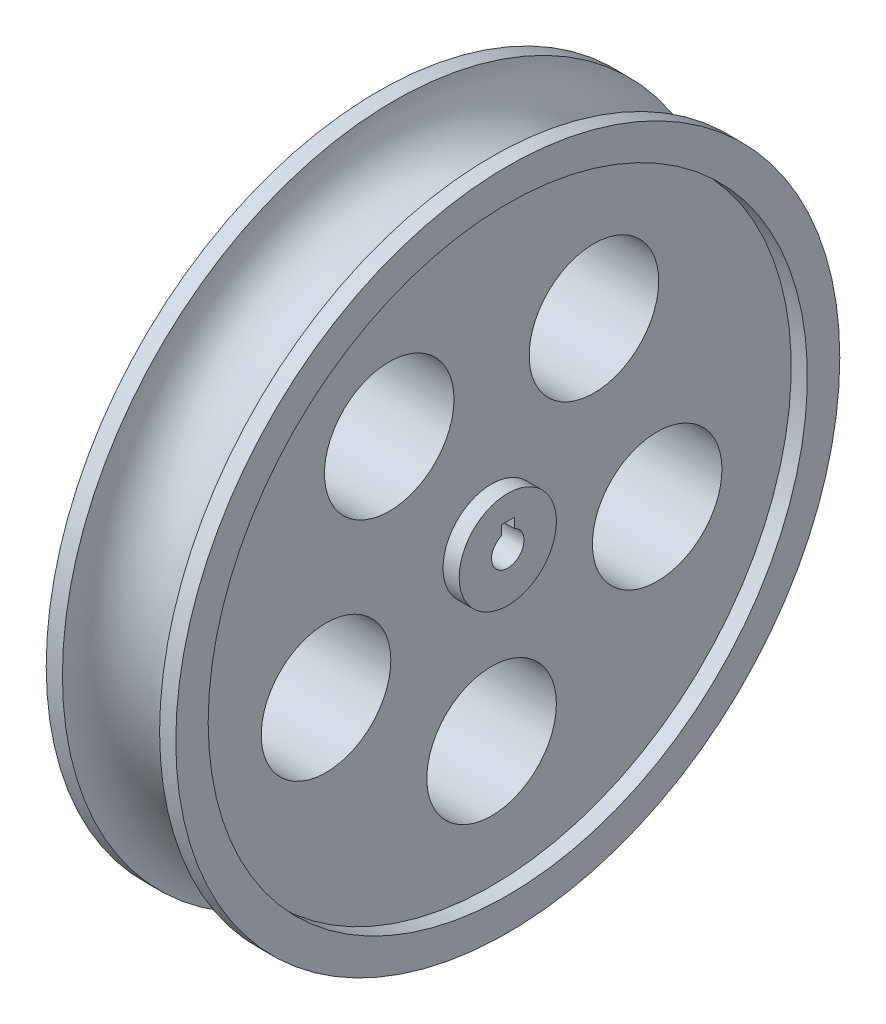
ISO-10303-21;
HEADER;
FILE_DESCRIPTION(('STEP AP214'),'2;1');
FILE_NAME('part.step','',(''),(''),'','','');
FILE_SCHEMA(('AUTOMOTIVE_DESIGN { 1 0 10303 214 1 1 1 1 }'));
ENDSEC;
DATA;
#1=APPLICATION_CONTEXT('core data for automotive mechanical design processes');
#2=APPLICATION_PROTOCOL_DEFINITION('international standard','automotive_design',2000,#1);
#3=PRODUCT_CONTEXT('',#1,'mechanical');
#4=PRODUCT('Part','Part','',(#3));
#5=PRODUCT_RELATED_PRODUCT_CATEGORY('part','',(#4));
#6=PRODUCT_DEFINITION_FORMATION('','',#4);
#7=PRODUCT_DEFINITION_CONTEXT('part definition',#1,'design');
#8=PRODUCT_DEFINITION('design','',#6,#7);
#9=PRODUCT_DEFINITION_SHAPE('','',#8);
#10=(LENGTH_UNIT() NAMED_UNIT(*) SI_UNIT(.MILLI.,.METRE.));
#11=(NAMED_UNIT(*) PLANE_ANGLE_UNIT() SI_UNIT($,.RADIAN.));
#12=(NAMED_UNIT(*) SI_UNIT($,.STERADIAN.) SOLID_ANGLE_UNIT());
#13=UNCERTAINTY_MEASURE_WITH_UNIT(LENGTH_MEASURE(1.E-05),#10,'distance_accuracy_value','');
#14=(GEOMETRIC_REPRESENTATION_CONTEXT(3) GLOBAL_UNCERTAINTY_ASSIGNED_CONTEXT((#13)) GLOBAL_UNIT_ASSIGNED_CONTEXT((#10,
#11,#12)) REPRESENTATION_CONTEXT('',''));
#15=CARTESIAN_POINT('',(0.,0.,0.));
#16=DIRECTION('',(0.,0.,1.));
#17=DIRECTION('',(1.,0.,0.));
#18=AXIS2_PLACEMENT_3D('',#15,#16,#17);
#19=CARTESIAN_POINT('',(75.,75.,0.));
#20=DIRECTION('',(-1.,0.,0.));
#21=DIRECTION('',(0.,0.,1.));
#22=AXIS2_PLACEMENT_3D('',#19,#20,#21);
#23=PLANE('',#22);
#24=CARTESIAN_POINT('',(75.,217.423317238266,-157.967286553604));
#25=DIRECTION('',(1.,0.,0.));
#26=DIRECTION('',(0.,0.,-1.));
#27=AXIS2_PLACEMENT_3D('',#24,#25,#26);
#28=CIRCLE('',#27,100.);
#29=CARTESIAN_POINT('',(75.,217.423317238266,-257.967286553604));
#30=VERTEX_POINT('',#29);
#31=EDGE_CURVE('E377',#30,#30,#28,.T.);
#32=ORIENTED_EDGE('',*,*,#31,.F.);
#33=EDGE_LOOP('',(#32));
#34=FACE_BOUND('',#33,.T.);
#35=CARTESIAN_POINT('',(75.,217.423317238268,157.967286553601));
#36=DIRECTION('',(1.,0.,0.));
#37=DIRECTION('',(0.,0.,-1.));
#38=AXIS2_PLACEMENT_3D('',#35,#36,#37);
#39=CIRCLE('',#38,100.);
#40=CARTESIAN_POINT('',(75.,217.423317238268,57.9672865536009));
#41=VERTEX_POINT('',#40);
#42=EDGE_CURVE('E381',#41,#41,#39,.T.);
#43=ORIENTED_EDGE('',*,*,#42,.F.);
#44=EDGE_LOOP('',(#43));
#45=FACE_BOUND('',#44,.T.);
#46=CARTESIAN_POINT('',(75.,-83.0483172382664,255.596438754323));
#47=DIRECTION('',(1.,0.,0.));
#48=DIRECTION('',(0.,0.,-1.));
#49=AXIS2_PLACEMENT_3D('',#46,#47,#48);
#50=CIRCLE('',#49,100.);
#51=CARTESIAN_POINT('',(75.,-83.0483172382664,155.596438754323));
#52=VERTEX_POINT('',#51);
#53=EDGE_CURVE('E374',#52,#52,#50,.T.);
#54=ORIENTED_EDGE('',*,*,#53,.F.);
#55=EDGE_LOOP('',(#54));
#56=FACE_BOUND('',#55,.T.);
#57=CARTESIAN_POINT('',(75.,-268.75,0.));
#58=DIRECTION('',(1.,0.,0.));
#59=DIRECTION('',(0.,0.,-1.));
#60=AXIS2_PLACEMENT_3D('',#57,#58,#59);
#61=CIRCLE('',#60,100.);
#62=CARTESIAN_POINT('',(75.,-268.75,-100.));
#63=VERTEX_POINT('',#62);
#64=EDGE_CURVE('E370',#63,#63,#61,.T.);
#65=ORIENTED_EDGE('',*,*,#64,.F.);
#66=EDGE_LOOP('',(#65));
#67=FACE_BOUND('',#66,.T.);
#68=CARTESIAN_POINT('',(75.,0.,0.));
#69=DIRECTION('',(-1.,0.,0.));
#70=DIRECTION('',(0.,0.,1.));
#71=AXIS2_PLACEMENT_3D('',#68,#69,#70);
#72=CIRCLE('',#71,462.5);
#73=CARTESIAN_POINT('',(75.,0.,462.5));
#74=VERTEX_POINT('',#73);
#75=EDGE_CURVE('E139',#74,#74,#72,.T.);
#76=ORIENTED_EDGE('',*,*,#75,.F.);
#77=EDGE_LOOP('',(#76));
#78=FACE_BOUND('',#77,.T.);
#79=CARTESIAN_POINT('',(75.,0.,0.));
#80=DIRECTION('',(-1.,0.,0.));
#81=DIRECTION('',(0.,0.,1.));
#82=AXIS2_PLACEMENT_3D('',#79,#80,#81);
#83=CIRCLE('',#82,75.);
#84=CARTESIAN_POINT('',(75.,0.,75.));
#85=VERTEX_POINT('',#84);
#86=EDGE_CURVE('E129',#85,#85,#83,.T.);
#87=ORIENTED_EDGE('',*,*,#86,.T.);
#88=EDGE_LOOP('',(#87));
#89=FACE_BOUND('',#88,.T.);
#90=CARTESIAN_POINT('',(75.,-83.04831723827,-255.596438754322));
#91=DIRECTION('',(1.,0.,0.));
#92=DIRECTION('',(0.,0.,-1.));
#93=AXIS2_PLACEMENT_3D('',#90,#91,#92);
#94=CIRCLE('',#93,100.);
#95=CARTESIAN_POINT('',(75.,-83.04831723827,-355.596438754322));
#96=VERTEX_POINT('',#95);
#97=EDGE_CURVE('E348',#96,#96,#94,.T.);
#98=ORIENTED_EDGE('',*,*,#97,.F.);
#99=EDGE_LOOP('',(#98));
#100=FACE_BOUND('',#99,.T.);
#101=ADVANCED_FACE('F47',(#34,#45,#56,#67,#78,#89,#100),#23,.F.);
#102=CARTESIAN_POINT('',(-60.7607906597794,0.,0.));
#103=DIRECTION('',(-1.,0.,0.));
#104=DIRECTION('',(0.,0.,1.));
#105=AXIS2_PLACEMENT_3D('',#102,#103,#104);
#106=CYLINDRICAL_SURFACE('',#105,75.);
#107=ORIENTED_EDGE('',*,*,#86,.F.);
#108=EDGE_LOOP('',(#107));
#109=FACE_BOUND('',#108,.T.);
#110=CARTESIAN_POINT('',(100.,0.,0.));
#111=DIRECTION('',(-1.,0.,0.));
#112=DIRECTION('',(0.,0.,1.));
#113=AXIS2_PLACEMENT_3D('',#110,#111,#112);
#114=CIRCLE('',#113,75.);
#115=CARTESIAN_POINT('',(100.,0.,75.));
#116=VERTEX_POINT('',#115);
#117=EDGE_CURVE('E11',#116,#116,#114,.T.);
#118=ORIENTED_EDGE('',*,*,#117,.T.);
#119=EDGE_LOOP('',(#118));
#120=FACE_BOUND('',#119,.T.);
#121=ADVANCED_FACE('F49',(#109,#120),#106,.T.);
#122=CARTESIAN_POINT('',(100.,25.,0.));
#123=DIRECTION('',(-1.,0.,0.));
#124=DIRECTION('',(0.,0.,1.));
#125=AXIS2_PLACEMENT_3D('',#122,#123,#124);
#126=PLANE('',#125);
#127=ORIENTED_EDGE('',*,*,#117,.F.);
#128=EDGE_LOOP('',(#127));
#129=FACE_BOUND('',#128,.T.);
#130=DIRECTION('',(0.,0.,1.));
#131=VECTOR('',#130,1.);
#132=CARTESIAN_POINT('',(100.,37.9128784747792,10.));
#133=LINE('',#132,#131);
#134=CARTESIAN_POINT('',(100.,37.9128784747792,-10.));
#135=VERTEX_POINT('',#134);
#136=CARTESIAN_POINT('',(100.,37.9128784747792,10.));
#137=VERTEX_POINT('',#136);
#138=EDGE_CURVE('E115',#135,#137,#133,.T.);
#139=ORIENTED_EDGE('',*,*,#138,.F.);
#140=DIRECTION('',(0.,1.,0.));
#141=VECTOR('',#140,1.);
#142=CARTESIAN_POINT('',(100.,22.9128784747792,-10.));
#143=LINE('',#142,#141);
#144=CARTESIAN_POINT('',(100.,22.9128784747792,-10.));
#145=VERTEX_POINT('',#144);
#146=EDGE_CURVE('E93',#145,#135,#143,.T.);
#147=ORIENTED_EDGE('',*,*,#146,.F.);
#148=CARTESIAN_POINT('',(100.,0.,0.));
#149=DIRECTION('',(-1.,0.,0.));
#150=DIRECTION('',(0.,0.,1.));
#151=AXIS2_PLACEMENT_3D('',#148,#149,#150);
#152=CIRCLE('',#151,25.);
#153=CARTESIAN_POINT('',(100.,22.9128784747792,10.));
#154=VERTEX_POINT('',#153);
#155=EDGE_CURVE('E57',#145,#154,#152,.T.);
#156=ORIENTED_EDGE('',*,*,#155,.T.);
#157=DIRECTION('',(0.,-1.,0.));
#158=VECTOR('',#157,1.);
#159=CARTESIAN_POINT('',(100.,37.9128784747792,10.));
#160=LINE('',#159,#158);
#161=EDGE_CURVE('E112',#137,#154,#160,.T.);
#162=ORIENTED_EDGE('',*,*,#161,.F.);
#163=EDGE_LOOP('',(#139,#147,#156,#162));
#164=FACE_BOUND('',#163,.T.);
#165=ADVANCED_FACE('F186',(#129,#164),#126,.F.);
#166=CARTESIAN_POINT('',(-60.7607906597794,0.,0.));
#167=DIRECTION('',(-1.,0.,0.));
#168=DIRECTION('',(0.,0.,1.));
#169=AXIS2_PLACEMENT_3D('',#166,#167,#168);
#170=CYLINDRICAL_SURFACE('',#169,25.);
#171=ORIENTED_EDGE('',*,*,#155,.F.);
#172=DIRECTION('',(1.,0.,0.));
#173=VECTOR('',#172,1.);
#174=CARTESIAN_POINT('',(-100.,22.9128784747792,-10.));
#175=LINE('',#174,#173);
#176=CARTESIAN_POINT('',(-100.,22.9128784747792,-10.));
#177=VERTEX_POINT('',#176);
#178=EDGE_CURVE('E88',#177,#145,#175,.T.);
#179=ORIENTED_EDGE('',*,*,#178,.F.);
#180=CARTESIAN_POINT('',(-100.,0.,0.));
#181=DIRECTION('',(-1.,0.,0.));
#182=DIRECTION('',(0.,0.,1.));
#183=AXIS2_PLACEMENT_3D('',#180,#181,#182);
#184=CIRCLE('',#183,25.);
#185=CARTESIAN_POINT('',(-100.,22.9128784747792,10.));
#186=VERTEX_POINT('',#185);
#187=EDGE_CURVE('E110',#177,#186,#184,.T.);
#188=ORIENTED_EDGE('',*,*,#187,.T.);
#189=DIRECTION('',(1.,0.,0.));
#190=VECTOR('',#189,1.);
#191=CARTESIAN_POINT('',(-100.,22.9128784747792,10.));
#192=LINE('',#191,#190);
#193=EDGE_CURVE('E130',#186,#154,#192,.T.);
#194=ORIENTED_EDGE('',*,*,#193,.T.);
#195=EDGE_LOOP('',(#171,#179,#188,#194));
#196=FACE_BOUND('',#195,.T.);
#197=ADVANCED_FACE('F188',(#196),#170,.F.);
#198=CARTESIAN_POINT('',(-100.,75.,0.));
#199=DIRECTION('',(1.,0.,0.));
#200=DIRECTION('',(0.,0.,-1.));
#201=AXIS2_PLACEMENT_3D('',#198,#199,#200);
#202=PLANE('',#201);
#203=ORIENTED_EDGE('',*,*,#187,.F.);
#204=DIRECTION('',(0.,1.,0.));
#205=VECTOR('',#204,1.);
#206=CARTESIAN_POINT('',(-100.,22.9128784747792,-10.));
#207=LINE('',#206,#205);
#208=CARTESIAN_POINT('',(-100.,37.9128784747792,-10.));
#209=VERTEX_POINT('',#208);
#210=EDGE_CURVE('E73',#177,#209,#207,.T.);
#211=ORIENTED_EDGE('',*,*,#210,.T.);
#212=DIRECTION('',(0.,0.,1.));
#213=VECTOR('',#212,1.);
#214=CARTESIAN_POINT('',(-100.,37.9128784747792,10.));
#215=LINE('',#214,#213);
#216=CARTESIAN_POINT('',(-100.,37.9128784747792,10.));
#217=VERTEX_POINT('',#216);
#218=EDGE_CURVE('E101',#209,#217,#215,.T.);
#219=ORIENTED_EDGE('',*,*,#218,.T.);
#220=DIRECTION('',(0.,-1.,0.));
#221=VECTOR('',#220,1.);
#222=CARTESIAN_POINT('',(-100.,37.9128784747792,10.));
#223=LINE('',#222,#221);
#224=EDGE_CURVE('E64',#217,#186,#223,.T.);
#225=ORIENTED_EDGE('',*,*,#224,.T.);
#226=EDGE_LOOP('',(#203,#211,#219,#225));
#227=FACE_BOUND('',#226,.T.);
#228=CARTESIAN_POINT('',(-100.,0.,0.));
#229=DIRECTION('',(-1.,0.,0.));
#230=DIRECTION('',(0.,0.,1.));
#231=AXIS2_PLACEMENT_3D('',#228,#229,#230);
#232=CIRCLE('',#231,75.);
#233=CARTESIAN_POINT('',(-100.,0.,75.));
#234=VERTEX_POINT('',#233);
#235=EDGE_CURVE('E175',#234,#234,#232,.T.);
#236=ORIENTED_EDGE('',*,*,#235,.T.);
#237=EDGE_LOOP('',(#236));
#238=FACE_BOUND('',#237,.T.);
#239=ADVANCED_FACE('F107',(#227,#238),#202,.F.);
#240=CARTESIAN_POINT('',(-60.7607906597794,0.,0.));
#241=DIRECTION('',(-1.,0.,0.));
#242=DIRECTION('',(0.,0.,1.));
#243=AXIS2_PLACEMENT_3D('',#240,#241,#242);
#244=CYLINDRICAL_SURFACE('',#243,75.);
#245=ORIENTED_EDGE('',*,*,#235,.F.);
#246=EDGE_LOOP('',(#245));
#247=FACE_BOUND('',#246,.T.);
#248=CARTESIAN_POINT('',(-75.,0.,0.));
#249=DIRECTION('',(-1.,0.,0.));
#250=DIRECTION('',(0.,0.,1.));
#251=AXIS2_PLACEMENT_3D('',#248,#249,#250);
#252=CIRCLE('',#251,75.);
#253=CARTESIAN_POINT('',(-75.,0.,75.));
#254=VERTEX_POINT('',#253);
#255=EDGE_CURVE('E171',#254,#254,#252,.T.);
#256=ORIENTED_EDGE('',*,*,#255,.T.);
#257=EDGE_LOOP('',(#256));
#258=FACE_BOUND('',#257,.T.);
#259=ADVANCED_FACE('F241',(#247,#258),#244,.T.);
#260=CARTESIAN_POINT('',(-75.,462.5,0.));
#261=DIRECTION('',(1.,0.,0.));
#262=DIRECTION('',(0.,0.,-1.));
#263=AXIS2_PLACEMENT_3D('',#260,#261,#262);
#264=PLANE('',#263);
#265=CARTESIAN_POINT('',(-75.,-83.04831723827,-255.596438754322));
#266=DIRECTION('',(1.,0.,0.));
#267=DIRECTION('',(0.,0.,-1.));
#268=AXIS2_PLACEMENT_3D('',#265,#266,#267);
#269=CIRCLE('',#268,100.);
#270=CARTESIAN_POINT('',(-75.,-83.04831723827,-355.596438754322));
#271=VERTEX_POINT('',#270);
#272=EDGE_CURVE('E51',#271,#271,#269,.T.);
#273=ORIENTED_EDGE('',*,*,#272,.T.);
#274=EDGE_LOOP('',(#273));
#275=FACE_BOUND('',#274,.T.);
#276=CARTESIAN_POINT('',(-75.,217.423317238266,-157.967286553604));
#277=DIRECTION('',(1.,0.,0.));
#278=DIRECTION('',(0.,0.,-1.));
#279=AXIS2_PLACEMENT_3D('',#276,#277,#278);
#280=CIRCLE('',#279,100.);
#281=CARTESIAN_POINT('',(-75.,217.423317238266,-257.967286553604));
#282=VERTEX_POINT('',#281);
#283=EDGE_CURVE('E118',#282,#282,#280,.T.);
#284=ORIENTED_EDGE('',*,*,#283,.T.);
#285=EDGE_LOOP('',(#284));
#286=FACE_BOUND('',#285,.T.);
#287=CARTESIAN_POINT('',(-75.,217.423317238268,157.967286553601));
#288=DIRECTION('',(1.,0.,0.));
#289=DIRECTION('',(0.,0.,-1.));
#290=AXIS2_PLACEMENT_3D('',#287,#288,#289);
#291=CIRCLE('',#290,100.);
#292=CARTESIAN_POINT('',(-75.,217.423317238268,57.9672865536009));
#293=VERTEX_POINT('',#292);
#294=EDGE_CURVE('E354',#293,#293,#291,.T.);
#295=ORIENTED_EDGE('',*,*,#294,.T.);
#296=EDGE_LOOP('',(#295));
#297=FACE_BOUND('',#296,.T.);
#298=CARTESIAN_POINT('',(-75.,-83.0483172382664,255.596438754323));
#299=DIRECTION('',(1.,0.,0.));
#300=DIRECTION('',(0.,0.,-1.));
#301=AXIS2_PLACEMENT_3D('',#298,#299,#300);
#302=CIRCLE('',#301,100.);
#303=CARTESIAN_POINT('',(-75.,-83.0483172382664,155.596438754323));
#304=VERTEX_POINT('',#303);
#305=EDGE_CURVE('E359',#304,#304,#302,.T.);
#306=ORIENTED_EDGE('',*,*,#305,.T.);
#307=EDGE_LOOP('',(#306));
#308=FACE_BOUND('',#307,.T.);
#309=CARTESIAN_POINT('',(-75.,-268.75,0.));
#310=DIRECTION('',(1.,0.,0.));
#311=DIRECTION('',(0.,0.,-1.));
#312=AXIS2_PLACEMENT_3D('',#309,#310,#311);
#313=CIRCLE('',#312,100.);
#314=CARTESIAN_POINT('',(-75.,-268.75,-100.));
#315=VERTEX_POINT('',#314);
#316=EDGE_CURVE('E364',#315,#315,#313,.T.);
#317=ORIENTED_EDGE('',*,*,#316,.T.);
#318=EDGE_LOOP('',(#317));
#319=FACE_BOUND('',#318,.T.);
#320=ORIENTED_EDGE('',*,*,#255,.F.);
#321=EDGE_LOOP('',(#320));
#322=FACE_BOUND('',#321,.T.);
#323=CARTESIAN_POINT('',(-75.,0.,0.));
#324=DIRECTION('',(-1.,0.,0.));
#325=DIRECTION('',(0.,0.,1.));
#326=AXIS2_PLACEMENT_3D('',#323,#324,#325);
#327=CIRCLE('',#326,462.5);
#328=CARTESIAN_POINT('',(-75.,0.,462.5));
#329=VERTEX_POINT('',#328);
#330=EDGE_CURVE('E167',#329,#329,#327,.T.);
#331=ORIENTED_EDGE('',*,*,#330,.T.);
#332=EDGE_LOOP('',(#331));
#333=FACE_BOUND('',#332,.T.);
#334=ADVANCED_FACE('F238',(#275,#286,#297,#308,#319,#322,#333),#264,.F.);
#335=CARTESIAN_POINT('',(-60.7607906597794,0.,0.));
#336=DIRECTION('',(-1.,0.,0.));
#337=DIRECTION('',(0.,0.,1.));
#338=AXIS2_PLACEMENT_3D('',#335,#336,#337);
#339=CYLINDRICAL_SURFACE('',#338,462.5);
#340=ORIENTED_EDGE('',*,*,#330,.F.);
#341=EDGE_LOOP('',(#340));
#342=FACE_BOUND('',#341,.T.);
#343=CARTESIAN_POINT('',(-100.,0.,0.));
#344=DIRECTION('',(-1.,0.,0.));
#345=DIRECTION('',(0.,0.,1.));
#346=AXIS2_PLACEMENT_3D('',#343,#344,#345);
#347=CIRCLE('',#346,462.5);
#348=CARTESIAN_POINT('',(-100.,0.,462.5));
#349=VERTEX_POINT('',#348);
#350=EDGE_CURVE('E163',#349,#349,#347,.T.);
#351=ORIENTED_EDGE('',*,*,#350,.T.);
#352=EDGE_LOOP('',(#351));
#353=FACE_BOUND('',#352,.T.);
#354=ADVANCED_FACE('F234',(#342,#353),#339,.F.);
#355=CARTESIAN_POINT('',(-100.,512.5,0.));
#356=DIRECTION('',(1.,0.,0.));
#357=DIRECTION('',(0.,0.,-1.));
#358=AXIS2_PLACEMENT_3D('',#355,#356,#357);
#359=PLANE('',#358);
#360=ORIENTED_EDGE('',*,*,#350,.F.);
#361=EDGE_LOOP('',(#360));
#362=FACE_BOUND('',#361,.T.);
#363=CARTESIAN_POINT('',(-100.,0.,0.));
#364=DIRECTION('',(-1.,0.,0.));
#365=DIRECTION('',(0.,0.,1.));
#366=AXIS2_PLACEMENT_3D('',#363,#364,#365);
#367=CIRCLE('',#366,512.5);
#368=CARTESIAN_POINT('',(-100.,0.,512.5));
#369=VERTEX_POINT('',#368);
#370=EDGE_CURVE('E159',#369,#369,#367,.T.);
#371=ORIENTED_EDGE('',*,*,#370,.T.);
#372=EDGE_LOOP('',(#371));
#373=FACE_BOUND('',#372,.T.);
#374=ADVANCED_FACE('F230',(#362,#373),#359,.F.);
#375=CARTESIAN_POINT('',(-60.7607906597794,0.,0.));
#376=DIRECTION('',(-1.,0.,0.));
#377=DIRECTION('',(0.,0.,1.));
#378=AXIS2_PLACEMENT_3D('',#375,#376,#377);
#379=CYLINDRICAL_SURFACE('',#378,512.5);
#380=ORIENTED_EDGE('',*,*,#370,.F.);
#381=EDGE_LOOP('',(#380));
#382=FACE_BOUND('',#381,.T.);
#383=CARTESIAN_POINT('',(-75.,0.,0.));
#384=DIRECTION('',(-1.,0.,0.));
#385=DIRECTION('',(0.,0.,1.));
#386=AXIS2_PLACEMENT_3D('',#383,#384,#385);
#387=CIRCLE('',#386,512.5);
#388=CARTESIAN_POINT('',(-75.,0.,512.5));
#389=VERTEX_POINT('',#388);
#390=EDGE_CURVE('E155',#389,#389,#387,.T.);
#391=ORIENTED_EDGE('',*,*,#390,.T.);
#392=EDGE_LOOP('',(#391));
#393=FACE_BOUND('',#392,.T.);
#394=ADVANCED_FACE('F226',(#382,#393),#379,.T.);
#395=CARTESIAN_POINT('',(0.,0.,0.));
#396=DIRECTION('',(-1.,0.,0.));
#397=DIRECTION('',(0.,0.,1.));
#398=AXIS2_PLACEMENT_3D('',#395,#396,#397);
#399=TOROIDAL_SURFACE('',#398,512.5,75.);
#400=ORIENTED_EDGE('',*,*,#390,.F.);
#401=EDGE_LOOP('',(#400));
#402=FACE_BOUND('',#401,.T.);
#403=CARTESIAN_POINT('',(75.,0.,0.));
#404=DIRECTION('',(-1.,0.,0.));
#405=DIRECTION('',(0.,0.,1.));
#406=AXIS2_PLACEMENT_3D('',#403,#404,#405);
#407=CIRCLE('',#406,512.5);
#408=CARTESIAN_POINT('',(75.,0.,512.5));
#409=VERTEX_POINT('',#408);
#410=EDGE_CURVE('E151',#409,#409,#407,.T.);
#411=ORIENTED_EDGE('',*,*,#410,.T.);
#412=EDGE_LOOP('',(#411));
#413=FACE_BOUND('',#412,.T.);
#414=ADVANCED_FACE('F222',(#402,#413),#399,.F.);
#415=CARTESIAN_POINT('',(-60.7607906597794,0.,0.));
#416=DIRECTION('',(-1.,0.,0.));
#417=DIRECTION('',(0.,0.,1.));
#418=AXIS2_PLACEMENT_3D('',#415,#416,#417);
#419=CYLINDRICAL_SURFACE('',#418,512.5);
#420=ORIENTED_EDGE('',*,*,#410,.F.);
#421=EDGE_LOOP('',(#420));
#422=FACE_BOUND('',#421,.T.);
#423=CARTESIAN_POINT('',(100.,0.,0.));
#424=DIRECTION('',(-1.,0.,0.));
#425=DIRECTION('',(0.,0.,1.));
#426=AXIS2_PLACEMENT_3D('',#423,#424,#425);
#427=CIRCLE('',#426,512.5);
#428=CARTESIAN_POINT('',(100.,0.,512.5));
#429=VERTEX_POINT('',#428);
#430=EDGE_CURVE('E147',#429,#429,#427,.T.);
#431=ORIENTED_EDGE('',*,*,#430,.T.);
#432=EDGE_LOOP('',(#431));
#433=FACE_BOUND('',#432,.T.);
#434=ADVANCED_FACE('F218',(#422,#433),#419,.T.);
#435=CARTESIAN_POINT('',(100.,462.5,0.));
#436=DIRECTION('',(-1.,0.,0.));
#437=DIRECTION('',(0.,0.,1.));
#438=AXIS2_PLACEMENT_3D('',#435,#436,#437);
#439=PLANE('',#438);
#440=ORIENTED_EDGE('',*,*,#430,.F.);
#441=EDGE_LOOP('',(#440));
#442=FACE_BOUND('',#441,.T.);
#443=CARTESIAN_POINT('',(100.,0.,0.));
#444=DIRECTION('',(-1.,0.,0.));
#445=DIRECTION('',(0.,0.,1.));
#446=AXIS2_PLACEMENT_3D('',#443,#444,#445);
#447=CIRCLE('',#446,462.5);
#448=CARTESIAN_POINT('',(100.,0.,462.5));
#449=VERTEX_POINT('',#448);
#450=EDGE_CURVE('E143',#449,#449,#447,.T.);
#451=ORIENTED_EDGE('',*,*,#450,.T.);
#452=EDGE_LOOP('',(#451));
#453=FACE_BOUND('',#452,.T.);
#454=ADVANCED_FACE('F214',(#442,#453),#439,.F.);
#455=CARTESIAN_POINT('',(-60.7607906597794,0.,0.));
#456=DIRECTION('',(-1.,0.,0.));
#457=DIRECTION('',(0.,0.,1.));
#458=AXIS2_PLACEMENT_3D('',#455,#456,#457);
#459=CYLINDRICAL_SURFACE('',#458,462.5);
#460=ORIENTED_EDGE('',*,*,#450,.F.);
#461=EDGE_LOOP('',(#460));
#462=FACE_BOUND('',#461,.T.);
#463=ORIENTED_EDGE('',*,*,#75,.T.);
#464=EDGE_LOOP('',(#463));
#465=FACE_BOUND('',#464,.T.);
#466=ADVANCED_FACE('F198',(#462,#465),#459,.F.);
#467=CARTESIAN_POINT('',(-100.,22.9128784747792,-10.));
#468=DIRECTION('',(0.,0.,-1.));
#469=DIRECTION('',(0.,1.,0.));
#470=AXIS2_PLACEMENT_3D('',#467,#468,#469);
#471=PLANE('',#470);
#472=ORIENTED_EDGE('',*,*,#146,.T.);
#473=DIRECTION('',(1.,0.,0.));
#474=VECTOR('',#473,1.);
#475=CARTESIAN_POINT('',(-100.,37.9128784747792,-10.));
#476=LINE('',#475,#474);
#477=EDGE_CURVE('E90',#209,#135,#476,.T.);
#478=ORIENTED_EDGE('',*,*,#477,.F.);
#479=ORIENTED_EDGE('',*,*,#210,.F.);
#480=ORIENTED_EDGE('',*,*,#178,.T.);
#481=EDGE_LOOP('',(#472,#478,#479,#480));
#482=FACE_BOUND('',#481,.T.);
#483=ADVANCED_FACE('F92',(#482),#471,.F.);
#484=CARTESIAN_POINT('',(-100.,37.9128784747792,10.));
#485=DIRECTION('',(0.,0.,1.));
#486=DIRECTION('',(0.,-1.,0.));
#487=AXIS2_PLACEMENT_3D('',#484,#485,#486);
#488=PLANE('',#487);
#489=ORIENTED_EDGE('',*,*,#161,.T.);
#490=ORIENTED_EDGE('',*,*,#193,.F.);
#491=ORIENTED_EDGE('',*,*,#224,.F.);
#492=DIRECTION('',(1.,0.,0.));
#493=VECTOR('',#492,1.);
#494=CARTESIAN_POINT('',(-100.,37.9128784747792,10.));
#495=LINE('',#494,#493);
#496=EDGE_CURVE('E98',#217,#137,#495,.T.);
#497=ORIENTED_EDGE('',*,*,#496,.T.);
#498=EDGE_LOOP('',(#489,#490,#491,#497));
#499=FACE_BOUND('',#498,.T.);
#500=ADVANCED_FACE('F189',(#499),#488,.F.);
#501=CARTESIAN_POINT('',(-100.,37.9128784747792,10.));
#502=DIRECTION('',(0.,1.,0.));
#503=DIRECTION('',(0.,0.,1.));
#504=AXIS2_PLACEMENT_3D('',#501,#502,#503);
#505=PLANE('',#504);
#506=ORIENTED_EDGE('',*,*,#138,.T.);
#507=ORIENTED_EDGE('',*,*,#496,.F.);
#508=ORIENTED_EDGE('',*,*,#218,.F.);
#509=ORIENTED_EDGE('',*,*,#477,.T.);
#510=EDGE_LOOP('',(#506,#507,#508,#509));
#511=FACE_BOUND('',#510,.T.);
#512=ADVANCED_FACE('F102',(#511),#505,.F.);
#513=CARTESIAN_POINT('',(-125.,-268.75,0.));
#514=DIRECTION('',(1.,0.,0.));
#515=DIRECTION('',(0.,0.,-1.));
#516=AXIS2_PLACEMENT_3D('',#513,#514,#515);
#517=CYLINDRICAL_SURFACE('',#516,100.);
#518=ORIENTED_EDGE('',*,*,#64,.T.);
#519=EDGE_LOOP('',(#518));
#520=FACE_BOUND('',#519,.T.);
#521=ORIENTED_EDGE('',*,*,#316,.F.);
#522=EDGE_LOOP('',(#521));
#523=FACE_BOUND('',#522,.T.);
#524=ADVANCED_FACE('F196',(#520,#523),#517,.F.);
#525=CARTESIAN_POINT('',(-125.,-83.0483172382664,255.596438754323));
#526=DIRECTION('',(1.,0.,0.));
#527=DIRECTION('',(0.,0.,-1.));
#528=AXIS2_PLACEMENT_3D('',#525,#526,#527);
#529=CYLINDRICAL_SURFACE('',#528,100.);
#530=ORIENTED_EDGE('',*,*,#53,.T.);
#531=EDGE_LOOP('',(#530));
#532=FACE_BOUND('',#531,.T.);
#533=ORIENTED_EDGE('',*,*,#305,.F.);
#534=EDGE_LOOP('',(#533));
#535=FACE_BOUND('',#534,.T.);
#536=ADVANCED_FACE('F303',(#532,#535),#529,.F.);
#537=CARTESIAN_POINT('',(-125.,217.423317238268,157.967286553601));
#538=DIRECTION('',(1.,0.,0.));
#539=DIRECTION('',(0.,0.,-1.));
#540=AXIS2_PLACEMENT_3D('',#537,#538,#539);
#541=CYLINDRICAL_SURFACE('',#540,100.);
#542=ORIENTED_EDGE('',*,*,#42,.T.);
#543=EDGE_LOOP('',(#542));
#544=FACE_BOUND('',#543,.T.);
#545=ORIENTED_EDGE('',*,*,#294,.F.);
#546=EDGE_LOOP('',(#545));
#547=FACE_BOUND('',#546,.T.);
#548=ADVANCED_FACE('F312',(#544,#547),#541,.F.);
#549=CARTESIAN_POINT('',(-125.,217.423317238266,-157.967286553604));
#550=DIRECTION('',(1.,0.,0.));
#551=DIRECTION('',(0.,0.,-1.));
#552=AXIS2_PLACEMENT_3D('',#549,#550,#551);
#553=CYLINDRICAL_SURFACE('',#552,100.);
#554=ORIENTED_EDGE('',*,*,#31,.T.);
#555=EDGE_LOOP('',(#554));
#556=FACE_BOUND('',#555,.T.);
#557=ORIENTED_EDGE('',*,*,#283,.F.);
#558=EDGE_LOOP('',(#557));
#559=FACE_BOUND('',#558,.T.);
#560=ADVANCED_FACE('F322',(#556,#559),#553,.F.);
#561=CARTESIAN_POINT('',(-125.,-83.04831723827,-255.596438754322));
#562=DIRECTION('',(1.,0.,0.));
#563=DIRECTION('',(0.,0.,-1.));
#564=AXIS2_PLACEMENT_3D('',#561,#562,#563);
#565=CYLINDRICAL_SURFACE('',#564,100.);
#566=ORIENTED_EDGE('',*,*,#97,.T.);
#567=EDGE_LOOP('',(#566));
#568=FACE_BOUND('',#567,.T.);
#569=ORIENTED_EDGE('',*,*,#272,.F.);
#570=EDGE_LOOP('',(#569));
#571=FACE_BOUND('',#570,.T.);
#572=ADVANCED_FACE('F332',(#568,#571),#565,.F.);
#573=CLOSED_SHELL('',(#101,#121,#165,#197,#239,#259,#334,#354,#374,#394,#414,#434,#454,#466,
#483,#500,#512,#524,#536,#548,#560,#572));
#574=MANIFOLD_SOLID_BREP('B2',#573);
#575=ADVANCED_BREP_SHAPE_REPRESENTATION('',(#18,#574),#14);
#576=SHAPE_DEFINITION_REPRESENTATION(#9,#575);
ENDSEC;
END-ISO-10303-21;
